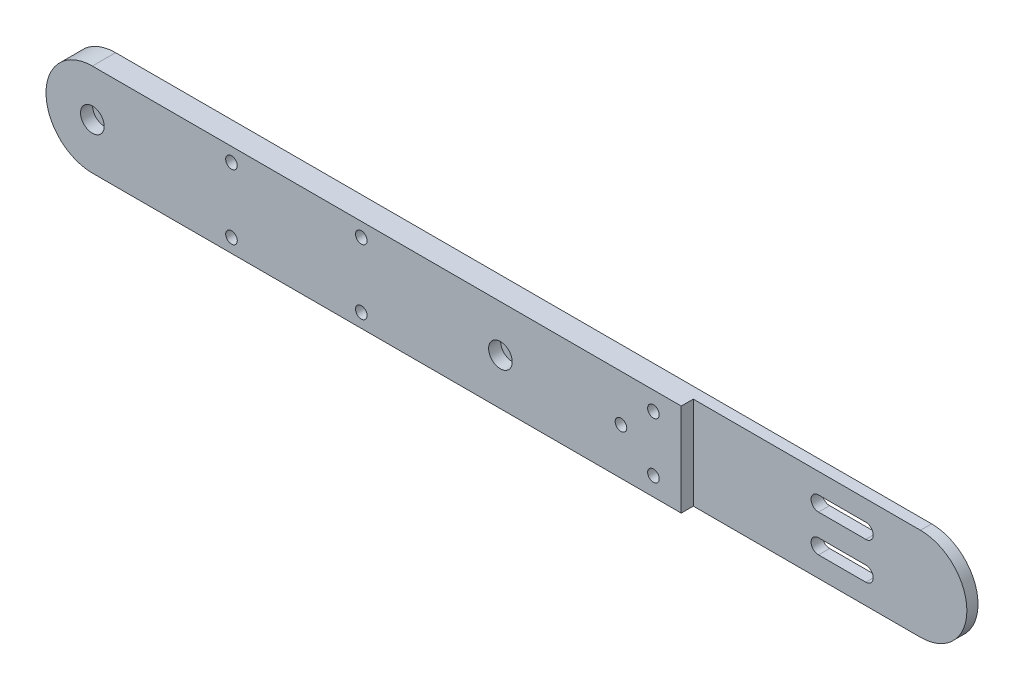
ISO-10303-21;
HEADER;
FILE_DESCRIPTION(('STEP AP214'),'2;1');
FILE_NAME('part.step','',(''),(''),'','','');
FILE_SCHEMA(('AUTOMOTIVE_DESIGN { 1 0 10303 214 1 1 1 1 }'));
ENDSEC;
DATA;
#1=APPLICATION_CONTEXT('core data for automotive mechanical design processes');
#2=APPLICATION_PROTOCOL_DEFINITION('international standard','automotive_design',2000,#1);
#3=PRODUCT_CONTEXT('',#1,'mechanical');
#4=PRODUCT('Part','Part','',(#3));
#5=PRODUCT_RELATED_PRODUCT_CATEGORY('part','',(#4));
#6=PRODUCT_DEFINITION_FORMATION('','',#4);
#7=PRODUCT_DEFINITION_CONTEXT('part definition',#1,'design');
#8=PRODUCT_DEFINITION('design','',#6,#7);
#9=PRODUCT_DEFINITION_SHAPE('','',#8);
#10=(LENGTH_UNIT() NAMED_UNIT(*) SI_UNIT(.MILLI.,.METRE.));
#11=(NAMED_UNIT(*) PLANE_ANGLE_UNIT() SI_UNIT($,.RADIAN.));
#12=(NAMED_UNIT(*) SI_UNIT($,.STERADIAN.) SOLID_ANGLE_UNIT());
#13=UNCERTAINTY_MEASURE_WITH_UNIT(LENGTH_MEASURE(1.E-05),#10,'distance_accuracy_value','');
#14=(GEOMETRIC_REPRESENTATION_CONTEXT(3) GLOBAL_UNCERTAINTY_ASSIGNED_CONTEXT((#13)) GLOBAL_UNIT_ASSIGNED_CONTEXT((#10,
#11,#12)) REPRESENTATION_CONTEXT('',''));
#15=CARTESIAN_POINT('',(0.,0.,0.));
#16=DIRECTION('',(0.,0.,1.));
#17=DIRECTION('',(1.,0.,0.));
#18=AXIS2_PLACEMENT_3D('',#15,#16,#17);
#19=CARTESIAN_POINT('',(121.,6.,25.));
#20=DIRECTION('',(0.,0.,1.));
#21=DIRECTION('',(-1.,0.,0.));
#22=AXIS2_PLACEMENT_3D('',#19,#20,#21);
#23=CYLINDRICAL_SURFACE('',#22,1.25);
#24=CARTESIAN_POINT('',(121.,6.,30.));
#25=DIRECTION('',(0.,0.,-1.));
#26=DIRECTION('',(-1.,0.,0.));
#27=AXIS2_PLACEMENT_3D('',#24,#25,#26);
#28=CIRCLE('',#27,1.25);
#29=CARTESIAN_POINT('',(119.75,6.,30.));
#30=VERTEX_POINT('',#29);
#31=EDGE_CURVE('E340',#30,#30,#28,.T.);
#32=ORIENTED_EDGE('',*,*,#31,.F.);
#33=EDGE_LOOP('',(#32));
#34=FACE_BOUND('',#33,.T.);
#35=CARTESIAN_POINT('',(121.,6.,27.5));
#36=DIRECTION('',(0.,0.,1.));
#37=DIRECTION('',(1.,0.,0.));
#38=AXIS2_PLACEMENT_3D('',#35,#36,#37);
#39=CIRCLE('',#38,1.25);
#40=CARTESIAN_POINT('',(122.25,6.,27.5));
#41=VERTEX_POINT('',#40);
#42=EDGE_CURVE('E356',#41,#41,#39,.F.);
#43=ORIENTED_EDGE('',*,*,#42,.T.);
#44=EDGE_LOOP('',(#43));
#45=FACE_BOUND('',#44,.T.);
#46=ADVANCED_FACE('F132',(#34,#45),#23,.F.);
#47=CARTESIAN_POINT('',(121.,-6.,25.));
#48=DIRECTION('',(0.,0.,1.));
#49=DIRECTION('',(-1.,0.,0.));
#50=AXIS2_PLACEMENT_3D('',#47,#48,#49);
#51=CYLINDRICAL_SURFACE('',#50,1.25);
#52=CARTESIAN_POINT('',(121.,-6.,30.));
#53=DIRECTION('',(0.,0.,-1.));
#54=DIRECTION('',(-1.,0.,0.));
#55=AXIS2_PLACEMENT_3D('',#52,#53,#54);
#56=CIRCLE('',#55,1.25);
#57=CARTESIAN_POINT('',(119.75,-6.,30.));
#58=VERTEX_POINT('',#57);
#59=EDGE_CURVE('E337',#58,#58,#56,.T.);
#60=ORIENTED_EDGE('',*,*,#59,.F.);
#61=EDGE_LOOP('',(#60));
#62=FACE_BOUND('',#61,.T.);
#63=CARTESIAN_POINT('',(121.,-6.,27.5));
#64=DIRECTION('',(0.,0.,1.));
#65=DIRECTION('',(1.,0.,0.));
#66=AXIS2_PLACEMENT_3D('',#63,#64,#65);
#67=CIRCLE('',#66,1.25);
#68=CARTESIAN_POINT('',(122.25,-6.,27.5));
#69=VERTEX_POINT('',#68);
#70=EDGE_CURVE('E431',#69,#69,#67,.F.);
#71=ORIENTED_EDGE('',*,*,#70,.T.);
#72=EDGE_LOOP('',(#71));
#73=FACE_BOUND('',#72,.T.);
#74=ADVANCED_FACE('F472',(#62,#73),#51,.F.);
#75=CARTESIAN_POINT('',(114.,0.,25.));
#76=DIRECTION('',(0.,0.,1.));
#77=DIRECTION('',(-1.,0.,0.));
#78=AXIS2_PLACEMENT_3D('',#75,#76,#77);
#79=CYLINDRICAL_SURFACE('',#78,1.25);
#80=CARTESIAN_POINT('',(114.,0.,30.));
#81=DIRECTION('',(0.,0.,-1.));
#82=DIRECTION('',(-1.,0.,0.));
#83=AXIS2_PLACEMENT_3D('',#80,#81,#82);
#84=CIRCLE('',#83,1.25);
#85=CARTESIAN_POINT('',(112.75,0.,30.));
#86=VERTEX_POINT('',#85);
#87=EDGE_CURVE('E341',#86,#86,#84,.T.);
#88=ORIENTED_EDGE('',*,*,#87,.F.);
#89=EDGE_LOOP('',(#88));
#90=FACE_BOUND('',#89,.T.);
#91=CARTESIAN_POINT('',(114.,0.,27.5));
#92=DIRECTION('',(0.,0.,1.));
#93=DIRECTION('',(1.,0.,0.));
#94=AXIS2_PLACEMENT_3D('',#91,#92,#93);
#95=CIRCLE('',#94,1.25);
#96=CARTESIAN_POINT('',(115.25,0.,27.5));
#97=VERTEX_POINT('',#96);
#98=EDGE_CURVE('E428',#97,#97,#95,.F.);
#99=ORIENTED_EDGE('',*,*,#98,.T.);
#100=EDGE_LOOP('',(#99));
#101=FACE_BOUND('',#100,.T.);
#102=ADVANCED_FACE('F478',(#90,#101),#79,.F.);
#103=CARTESIAN_POINT('',(58.,-7.,25.));
#104=DIRECTION('',(0.,0.,1.));
#105=DIRECTION('',(-1.,0.,0.));
#106=AXIS2_PLACEMENT_3D('',#103,#104,#105);
#107=CYLINDRICAL_SURFACE('',#106,1.25);
#108=CARTESIAN_POINT('',(58.,-7.,30.));
#109=DIRECTION('',(0.,0.,-1.));
#110=DIRECTION('',(-1.,0.,0.));
#111=AXIS2_PLACEMENT_3D('',#108,#109,#110);
#112=CIRCLE('',#111,1.25);
#113=CARTESIAN_POINT('',(56.75,-7.,30.));
#114=VERTEX_POINT('',#113);
#115=EDGE_CURVE('E344',#114,#114,#112,.T.);
#116=ORIENTED_EDGE('',*,*,#115,.F.);
#117=EDGE_LOOP('',(#116));
#118=FACE_BOUND('',#117,.T.);
#119=CARTESIAN_POINT('',(58.,-7.,27.5));
#120=DIRECTION('',(0.,0.,1.));
#121=DIRECTION('',(1.,0.,0.));
#122=AXIS2_PLACEMENT_3D('',#119,#120,#121);
#123=CIRCLE('',#122,1.25);
#124=CARTESIAN_POINT('',(59.25,-7.,27.5));
#125=VERTEX_POINT('',#124);
#126=EDGE_CURVE('E425',#125,#125,#123,.F.);
#127=ORIENTED_EDGE('',*,*,#126,.T.);
#128=EDGE_LOOP('',(#127));
#129=FACE_BOUND('',#128,.T.);
#130=ADVANCED_FACE('F613',(#118,#129),#107,.F.);
#131=CARTESIAN_POINT('',(30.,-7.,25.));
#132=DIRECTION('',(0.,0.,1.));
#133=DIRECTION('',(-1.,0.,0.));
#134=AXIS2_PLACEMENT_3D('',#131,#132,#133);
#135=CYLINDRICAL_SURFACE('',#134,1.25);
#136=CARTESIAN_POINT('',(30.,-7.,30.));
#137=DIRECTION('',(0.,0.,-1.));
#138=DIRECTION('',(-1.,0.,0.));
#139=AXIS2_PLACEMENT_3D('',#136,#137,#138);
#140=CIRCLE('',#139,1.25);
#141=CARTESIAN_POINT('',(28.75,-7.,30.));
#142=VERTEX_POINT('',#141);
#143=EDGE_CURVE('E347',#142,#142,#140,.T.);
#144=ORIENTED_EDGE('',*,*,#143,.F.);
#145=EDGE_LOOP('',(#144));
#146=FACE_BOUND('',#145,.T.);
#147=CARTESIAN_POINT('',(30.,-7.,27.5));
#148=DIRECTION('',(0.,0.,1.));
#149=DIRECTION('',(1.,0.,0.));
#150=AXIS2_PLACEMENT_3D('',#147,#148,#149);
#151=CIRCLE('',#150,1.25);
#152=CARTESIAN_POINT('',(31.25,-7.,27.5));
#153=VERTEX_POINT('',#152);
#154=EDGE_CURVE('E422',#153,#153,#151,.F.);
#155=ORIENTED_EDGE('',*,*,#154,.T.);
#156=EDGE_LOOP('',(#155));
#157=FACE_BOUND('',#156,.T.);
#158=ADVANCED_FACE('F617',(#146,#157),#135,.F.);
#159=CARTESIAN_POINT('',(30.,7.,25.));
#160=DIRECTION('',(0.,0.,1.));
#161=DIRECTION('',(-1.,0.,0.));
#162=AXIS2_PLACEMENT_3D('',#159,#160,#161);
#163=CYLINDRICAL_SURFACE('',#162,1.25);
#164=CARTESIAN_POINT('',(30.,7.,30.));
#165=DIRECTION('',(0.,0.,-1.));
#166=DIRECTION('',(-1.,0.,0.));
#167=AXIS2_PLACEMENT_3D('',#164,#165,#166);
#168=CIRCLE('',#167,1.25);
#169=CARTESIAN_POINT('',(28.75,7.,30.));
#170=VERTEX_POINT('',#169);
#171=EDGE_CURVE('E350',#170,#170,#168,.T.);
#172=ORIENTED_EDGE('',*,*,#171,.F.);
#173=EDGE_LOOP('',(#172));
#174=FACE_BOUND('',#173,.T.);
#175=CARTESIAN_POINT('',(30.,7.,27.5));
#176=DIRECTION('',(0.,0.,1.));
#177=DIRECTION('',(1.,0.,0.));
#178=AXIS2_PLACEMENT_3D('',#175,#176,#177);
#179=CIRCLE('',#178,1.25);
#180=CARTESIAN_POINT('',(31.25,7.,27.5));
#181=VERTEX_POINT('',#180);
#182=EDGE_CURVE('E419',#181,#181,#179,.F.);
#183=ORIENTED_EDGE('',*,*,#182,.T.);
#184=EDGE_LOOP('',(#183));
#185=FACE_BOUND('',#184,.T.);
#186=ADVANCED_FACE('F620',(#174,#185),#163,.F.);
#187=CARTESIAN_POINT('',(58.,7.,25.));
#188=DIRECTION('',(0.,0.,1.));
#189=DIRECTION('',(-1.,0.,0.));
#190=AXIS2_PLACEMENT_3D('',#187,#188,#189);
#191=CYLINDRICAL_SURFACE('',#190,1.25);
#192=CARTESIAN_POINT('',(58.,7.,30.));
#193=DIRECTION('',(0.,0.,-1.));
#194=DIRECTION('',(-1.,0.,0.));
#195=AXIS2_PLACEMENT_3D('',#192,#193,#194);
#196=CIRCLE('',#195,1.25);
#197=CARTESIAN_POINT('',(56.75,7.,30.));
#198=VERTEX_POINT('',#197);
#199=EDGE_CURVE('E353',#198,#198,#196,.T.);
#200=ORIENTED_EDGE('',*,*,#199,.F.);
#201=EDGE_LOOP('',(#200));
#202=FACE_BOUND('',#201,.T.);
#203=CARTESIAN_POINT('',(58.,7.,27.5));
#204=DIRECTION('',(0.,0.,1.));
#205=DIRECTION('',(1.,0.,0.));
#206=AXIS2_PLACEMENT_3D('',#203,#204,#205);
#207=CIRCLE('',#206,1.25);
#208=CARTESIAN_POINT('',(59.25,7.,27.5));
#209=VERTEX_POINT('',#208);
#210=EDGE_CURVE('E336',#209,#209,#207,.F.);
#211=ORIENTED_EDGE('',*,*,#210,.T.);
#212=EDGE_LOOP('',(#211));
#213=FACE_BOUND('',#212,.T.);
#214=ADVANCED_FACE('F485',(#202,#213),#191,.F.);
#215=CARTESIAN_POINT('',(0.,0.,25.));
#216=DIRECTION('',(0.,0.,1.));
#217=DIRECTION('',(-1.,0.,0.));
#218=AXIS2_PLACEMENT_3D('',#215,#216,#217);
#219=CYLINDRICAL_SURFACE('',#218,10.);
#220=DIRECTION('',(0.,0.,1.));
#221=VECTOR('',#220,1.);
#222=CARTESIAN_POINT('',(0.,10.,25.));
#223=LINE('',#222,#221);
#224=CARTESIAN_POINT('',(0.,10.,30.));
#225=VERTEX_POINT('',#224);
#226=CARTESIAN_POINT('',(0.,10.,25.));
#227=VERTEX_POINT('',#226);
#228=EDGE_CURVE('E390',#225,#227,#223,.F.);
#229=ORIENTED_EDGE('',*,*,#228,.T.);
#230=CARTESIAN_POINT('',(0.,0.,25.));
#231=DIRECTION('',(0.,0.,1.));
#232=DIRECTION('',(1.,0.,0.));
#233=AXIS2_PLACEMENT_3D('',#230,#231,#232);
#234=CIRCLE('',#233,10.);
#235=CARTESIAN_POINT('',(0.,-10.,25.));
#236=VERTEX_POINT('',#235);
#237=EDGE_CURVE('E380',#227,#236,#234,.T.);
#238=ORIENTED_EDGE('',*,*,#237,.T.);
#239=DIRECTION('',(0.,0.,1.));
#240=VECTOR('',#239,1.);
#241=CARTESIAN_POINT('',(0.,-10.,25.));
#242=LINE('',#241,#240);
#243=CARTESIAN_POINT('',(0.,-10.,30.));
#244=VERTEX_POINT('',#243);
#245=EDGE_CURVE('E383',#236,#244,#242,.T.);
#246=ORIENTED_EDGE('',*,*,#245,.T.);
#247=CARTESIAN_POINT('',(0.,0.,30.));
#248=DIRECTION('',(0.,0.,1.));
#249=DIRECTION('',(1.,0.,0.));
#250=AXIS2_PLACEMENT_3D('',#247,#248,#249);
#251=CIRCLE('',#250,10.);
#252=EDGE_CURVE('E384',#225,#244,#251,.T.);
#253=ORIENTED_EDGE('',*,*,#252,.F.);
#254=EDGE_LOOP('',(#229,#238,#246,#253));
#255=FACE_BOUND('',#254,.T.);
#256=ADVANCED_FACE('F518',(#255),#219,.T.);
#257=CARTESIAN_POINT('',(0.,0.,30.));
#258=DIRECTION('',(0.,0.,-1.));
#259=DIRECTION('',(1.,0.,0.));
#260=AXIS2_PLACEMENT_3D('',#257,#258,#259);
#261=PLANE('',#260);
#262=ORIENTED_EDGE('',*,*,#199,.T.);
#263=EDGE_LOOP('',(#262));
#264=FACE_BOUND('',#263,.T.);
#265=ORIENTED_EDGE('',*,*,#171,.T.);
#266=EDGE_LOOP('',(#265));
#267=FACE_BOUND('',#266,.T.);
#268=ORIENTED_EDGE('',*,*,#143,.T.);
#269=EDGE_LOOP('',(#268));
#270=FACE_BOUND('',#269,.T.);
#271=ORIENTED_EDGE('',*,*,#115,.T.);
#272=EDGE_LOOP('',(#271));
#273=FACE_BOUND('',#272,.T.);
#274=ORIENTED_EDGE('',*,*,#87,.T.);
#275=EDGE_LOOP('',(#274));
#276=FACE_BOUND('',#275,.T.);
#277=ORIENTED_EDGE('',*,*,#59,.T.);
#278=EDGE_LOOP('',(#277));
#279=FACE_BOUND('',#278,.T.);
#280=ORIENTED_EDGE('',*,*,#31,.T.);
#281=EDGE_LOOP('',(#280));
#282=FACE_BOUND('',#281,.T.);
#283=CARTESIAN_POINT('',(88.,0.,30.));
#284=DIRECTION('',(0.,0.,1.));
#285=DIRECTION('',(1.,0.,0.));
#286=AXIS2_PLACEMENT_3D('',#283,#284,#285);
#287=CIRCLE('',#286,2.54999999999999);
#288=CARTESIAN_POINT('',(90.55,0.,30.));
#289=VERTEX_POINT('',#288);
#290=EDGE_CURVE('E364',#289,#289,#287,.T.);
#291=ORIENTED_EDGE('',*,*,#290,.F.);
#292=EDGE_LOOP('',(#291));
#293=FACE_BOUND('',#292,.T.);
#294=CARTESIAN_POINT('',(0.,0.,30.));
#295=DIRECTION('',(0.,0.,1.));
#296=DIRECTION('',(1.,0.,0.));
#297=AXIS2_PLACEMENT_3D('',#294,#295,#296);
#298=CIRCLE('',#297,2.55);
#299=CARTESIAN_POINT('',(2.55,0.,30.));
#300=VERTEX_POINT('',#299);
#301=EDGE_CURVE('E367',#300,#300,#298,.T.);
#302=ORIENTED_EDGE('',*,*,#301,.F.);
#303=EDGE_LOOP('',(#302));
#304=FACE_BOUND('',#303,.T.);
#305=DIRECTION('',(1.,0.,0.));
#306=VECTOR('',#305,1.);
#307=CARTESIAN_POINT('',(0.,10.,30.));
#308=LINE('',#307,#306);
#309=CARTESIAN_POINT('',(127.,10.,30.));
#310=VERTEX_POINT('',#309);
#311=EDGE_CURVE('E398',#225,#310,#308,.T.);
#312=ORIENTED_EDGE('',*,*,#311,.F.);
#313=ORIENTED_EDGE('',*,*,#252,.T.);
#314=DIRECTION('',(1.,0.,0.));
#315=VECTOR('',#314,1.);
#316=CARTESIAN_POINT('',(0.,-10.,30.));
#317=LINE('',#316,#315);
#318=CARTESIAN_POINT('',(127.,-10.,30.));
#319=VERTEX_POINT('',#318);
#320=EDGE_CURVE('E402',#244,#319,#317,.T.);
#321=ORIENTED_EDGE('',*,*,#320,.T.);
#322=DIRECTION('',(0.,1.,0.));
#323=VECTOR('',#322,1.);
#324=CARTESIAN_POINT('',(127.,-10.,30.));
#325=LINE('',#324,#323);
#326=EDGE_CURVE('E287',#319,#310,#325,.T.);
#327=ORIENTED_EDGE('',*,*,#326,.T.);
#328=EDGE_LOOP('',(#312,#313,#321,#327));
#329=FACE_BOUND('',#328,.T.);
#330=ADVANCED_FACE('F515',(#264,#267,#270,#273,#276,#279,#282,#293,#304,#329),#261,.F.);
#331=CARTESIAN_POINT('',(0.,0.,25.));
#332=DIRECTION('',(0.,0.,-1.));
#333=DIRECTION('',(1.,0.,0.));
#334=AXIS2_PLACEMENT_3D('',#331,#332,#333);
#335=PLANE('',#334);
#336=CARTESIAN_POINT('',(154.,-4.,25.));
#337=DIRECTION('',(0.,0.,1.));
#338=DIRECTION('',(1.,0.,0.));
#339=AXIS2_PLACEMENT_3D('',#336,#337,#338);
#340=CIRCLE('',#339,1.59999999999999);
#341=CARTESIAN_POINT('',(154.,-2.4,25.));
#342=VERTEX_POINT('',#341);
#343=CARTESIAN_POINT('',(154.,-5.6,25.));
#344=VERTEX_POINT('',#343);
#345=EDGE_CURVE('E237',#342,#344,#340,.T.);
#346=ORIENTED_EDGE('',*,*,#345,.T.);
#347=DIRECTION('',(-1.,0.,0.));
#348=VECTOR('',#347,1.);
#349=CARTESIAN_POINT('',(164.2,-5.6,25.));
#350=LINE('',#349,#348);
#351=CARTESIAN_POINT('',(164.2,-5.59999999999999,25.));
#352=VERTEX_POINT('',#351);
#353=EDGE_CURVE('E243',#352,#344,#350,.T.);
#354=ORIENTED_EDGE('',*,*,#353,.F.);
#355=CARTESIAN_POINT('',(164.2,-4.,25.));
#356=DIRECTION('',(0.,0.,1.));
#357=DIRECTION('',(1.,0.,0.));
#358=AXIS2_PLACEMENT_3D('',#355,#356,#357);
#359=CIRCLE('',#358,1.59999999999999);
#360=CARTESIAN_POINT('',(164.2,-2.4,25.));
#361=VERTEX_POINT('',#360);
#362=EDGE_CURVE('E253',#352,#361,#359,.T.);
#363=ORIENTED_EDGE('',*,*,#362,.T.);
#364=DIRECTION('',(-1.,0.,0.));
#365=VECTOR('',#364,1.);
#366=CARTESIAN_POINT('',(164.2,-2.4,25.));
#367=LINE('',#366,#365);
#368=EDGE_CURVE('E247',#361,#342,#367,.T.);
#369=ORIENTED_EDGE('',*,*,#368,.T.);
#370=EDGE_LOOP('',(#346,#354,#363,#369));
#371=FACE_BOUND('',#370,.T.);
#372=DIRECTION('',(-1.,0.,0.));
#373=VECTOR('',#372,1.);
#374=CARTESIAN_POINT('',(164.2,5.6,25.));
#375=LINE('',#374,#373);
#376=CARTESIAN_POINT('',(164.2,5.6,25.));
#377=VERTEX_POINT('',#376);
#378=CARTESIAN_POINT('',(154.,5.59999999999999,25.));
#379=VERTEX_POINT('',#378);
#380=EDGE_CURVE('E267',#377,#379,#375,.T.);
#381=ORIENTED_EDGE('',*,*,#380,.T.);
#382=CARTESIAN_POINT('',(154.,4.,25.));
#383=DIRECTION('',(0.,0.,1.));
#384=DIRECTION('',(1.,0.,0.));
#385=AXIS2_PLACEMENT_3D('',#382,#383,#384);
#386=CIRCLE('',#385,1.59999999999999);
#387=CARTESIAN_POINT('',(154.,2.4,25.));
#388=VERTEX_POINT('',#387);
#389=EDGE_CURVE('E265',#379,#388,#386,.T.);
#390=ORIENTED_EDGE('',*,*,#389,.T.);
#391=DIRECTION('',(-1.,0.,0.));
#392=VECTOR('',#391,1.);
#393=CARTESIAN_POINT('',(164.2,2.4,25.));
#394=LINE('',#393,#392);
#395=CARTESIAN_POINT('',(164.2,2.4,25.));
#396=VERTEX_POINT('',#395);
#397=EDGE_CURVE('E261',#396,#388,#394,.T.);
#398=ORIENTED_EDGE('',*,*,#397,.F.);
#399=CARTESIAN_POINT('',(164.2,4.,25.));
#400=DIRECTION('',(0.,0.,1.));
#401=DIRECTION('',(1.,0.,0.));
#402=AXIS2_PLACEMENT_3D('',#399,#400,#401);
#403=CIRCLE('',#402,1.59999999999999);
#404=EDGE_CURVE('E255',#396,#377,#403,.T.);
#405=ORIENTED_EDGE('',*,*,#404,.T.);
#406=EDGE_LOOP('',(#381,#390,#398,#405));
#407=FACE_BOUND('',#406,.T.);
#408=CARTESIAN_POINT('',(121.,-6.,25.));
#409=DIRECTION('',(0.,0.,1.));
#410=DIRECTION('',(1.,0.,0.));
#411=AXIS2_PLACEMENT_3D('',#408,#409,#410);
#412=CIRCLE('',#411,2.);
#413=CARTESIAN_POINT('',(123.,-6.,25.));
#414=VERTEX_POINT('',#413);
#415=EDGE_CURVE('E310',#414,#414,#412,.T.);
#416=ORIENTED_EDGE('',*,*,#415,.T.);
#417=EDGE_LOOP('',(#416));
#418=FACE_BOUND('',#417,.T.);
#419=CARTESIAN_POINT('',(114.,0.,25.));
#420=DIRECTION('',(0.,0.,1.));
#421=DIRECTION('',(1.,0.,0.));
#422=AXIS2_PLACEMENT_3D('',#419,#420,#421);
#423=CIRCLE('',#422,2.);
#424=CARTESIAN_POINT('',(116.,0.,25.));
#425=VERTEX_POINT('',#424);
#426=EDGE_CURVE('E311',#425,#425,#423,.T.);
#427=ORIENTED_EDGE('',*,*,#426,.T.);
#428=EDGE_LOOP('',(#427));
#429=FACE_BOUND('',#428,.T.);
#430=CARTESIAN_POINT('',(58.,7.,25.));
#431=DIRECTION('',(0.,0.,1.));
#432=DIRECTION('',(1.,0.,0.));
#433=AXIS2_PLACEMENT_3D('',#430,#431,#432);
#434=CIRCLE('',#433,2.);
#435=CARTESIAN_POINT('',(60.,7.,25.));
#436=VERTEX_POINT('',#435);
#437=EDGE_CURVE('E318',#436,#436,#434,.T.);
#438=ORIENTED_EDGE('',*,*,#437,.T.);
#439=EDGE_LOOP('',(#438));
#440=FACE_BOUND('',#439,.T.);
#441=CARTESIAN_POINT('',(30.,7.,25.));
#442=DIRECTION('',(0.,0.,1.));
#443=DIRECTION('',(1.,0.,0.));
#444=AXIS2_PLACEMENT_3D('',#441,#442,#443);
#445=CIRCLE('',#444,2.);
#446=CARTESIAN_POINT('',(32.,7.,25.));
#447=VERTEX_POINT('',#446);
#448=EDGE_CURVE('E324',#447,#447,#445,.T.);
#449=ORIENTED_EDGE('',*,*,#448,.T.);
#450=EDGE_LOOP('',(#449));
#451=FACE_BOUND('',#450,.T.);
#452=CARTESIAN_POINT('',(30.,-7.,25.));
#453=DIRECTION('',(0.,0.,1.));
#454=DIRECTION('',(1.,0.,0.));
#455=AXIS2_PLACEMENT_3D('',#452,#453,#454);
#456=CIRCLE('',#455,2.);
#457=CARTESIAN_POINT('',(32.,-7.,25.));
#458=VERTEX_POINT('',#457);
#459=EDGE_CURVE('E298',#458,#458,#456,.T.);
#460=ORIENTED_EDGE('',*,*,#459,.T.);
#461=EDGE_LOOP('',(#460));
#462=FACE_BOUND('',#461,.T.);
#463=CARTESIAN_POINT('',(58.,-7.,25.));
#464=DIRECTION('',(0.,0.,1.));
#465=DIRECTION('',(1.,0.,0.));
#466=AXIS2_PLACEMENT_3D('',#463,#464,#465);
#467=CIRCLE('',#466,2.);
#468=CARTESIAN_POINT('',(60.,-7.,25.));
#469=VERTEX_POINT('',#468);
#470=EDGE_CURVE('E299',#469,#469,#467,.T.);
#471=ORIENTED_EDGE('',*,*,#470,.T.);
#472=EDGE_LOOP('',(#471));
#473=FACE_BOUND('',#472,.T.);
#474=CARTESIAN_POINT('',(121.,6.,25.));
#475=DIRECTION('',(0.,0.,1.));
#476=DIRECTION('',(1.,0.,0.));
#477=AXIS2_PLACEMENT_3D('',#474,#475,#476);
#478=CIRCLE('',#477,2.);
#479=CARTESIAN_POINT('',(123.,6.,25.));
#480=VERTEX_POINT('',#479);
#481=EDGE_CURVE('E314',#480,#480,#478,.T.);
#482=ORIENTED_EDGE('',*,*,#481,.T.);
#483=EDGE_LOOP('',(#482));
#484=FACE_BOUND('',#483,.T.);
#485=CARTESIAN_POINT('',(0.,0.,25.));
#486=DIRECTION('',(0.,0.,1.));
#487=DIRECTION('',(1.,0.,0.));
#488=AXIS2_PLACEMENT_3D('',#485,#486,#487);
#489=CIRCLE('',#488,1.1);
#490=CARTESIAN_POINT('',(1.1,0.,25.));
#491=VERTEX_POINT('',#490);
#492=EDGE_CURVE('E372',#491,#491,#489,.T.);
#493=ORIENTED_EDGE('',*,*,#492,.T.);
#494=EDGE_LOOP('',(#493));
#495=FACE_BOUND('',#494,.T.);
#496=CARTESIAN_POINT('',(88.,0.,25.));
#497=DIRECTION('',(0.,0.,1.));
#498=DIRECTION('',(1.,0.,0.));
#499=AXIS2_PLACEMENT_3D('',#496,#497,#498);
#500=CIRCLE('',#499,1.09999999999999);
#501=CARTESIAN_POINT('',(89.1,0.,25.));
#502=VERTEX_POINT('',#501);
#503=EDGE_CURVE('E376',#502,#502,#500,.T.);
#504=ORIENTED_EDGE('',*,*,#503,.T.);
#505=EDGE_LOOP('',(#504));
#506=FACE_BOUND('',#505,.T.);
#507=ORIENTED_EDGE('',*,*,#237,.F.);
#508=DIRECTION('',(1.,0.,0.));
#509=VECTOR('',#508,1.);
#510=CARTESIAN_POINT('',(0.,10.,25.));
#511=LINE('',#510,#509);
#512=CARTESIAN_POINT('',(176.,10.,25.));
#513=VERTEX_POINT('',#512);
#514=EDGE_CURVE('E397',#227,#513,#511,.T.);
#515=ORIENTED_EDGE('',*,*,#514,.T.);
#516=CARTESIAN_POINT('',(176.,0.,25.));
#517=DIRECTION('',(0.,0.,1.));
#518=DIRECTION('',(1.,0.,0.));
#519=AXIS2_PLACEMENT_3D('',#516,#517,#518);
#520=CIRCLE('',#519,10.);
#521=CARTESIAN_POINT('',(176.,-10.,25.));
#522=VERTEX_POINT('',#521);
#523=EDGE_CURVE('E375',#522,#513,#520,.T.);
#524=ORIENTED_EDGE('',*,*,#523,.F.);
#525=DIRECTION('',(1.,0.,0.));
#526=VECTOR('',#525,1.);
#527=CARTESIAN_POINT('',(0.,-10.,25.));
#528=LINE('',#527,#526);
#529=EDGE_CURVE('E394',#236,#522,#528,.T.);
#530=ORIENTED_EDGE('',*,*,#529,.F.);
#531=EDGE_LOOP('',(#507,#515,#524,#530));
#532=FACE_BOUND('',#531,.T.);
#533=ADVANCED_FACE('F250',(#371,#407,#418,#429,#440,#451,#462,#473,#484,#495,#506,#532),#335,.T.);
#534=CARTESIAN_POINT('',(176.,0.,25.));
#535=DIRECTION('',(0.,0.,1.));
#536=DIRECTION('',(-1.,0.,0.));
#537=AXIS2_PLACEMENT_3D('',#534,#535,#536);
#538=CYLINDRICAL_SURFACE('',#537,10.);
#539=CARTESIAN_POINT('',(176.,0.,27.4));
#540=DIRECTION('',(0.,0.,1.));
#541=DIRECTION('',(1.,0.,0.));
#542=AXIS2_PLACEMENT_3D('',#539,#540,#541);
#543=CIRCLE('',#542,10.);
#544=CARTESIAN_POINT('',(176.,-10.,27.4));
#545=VERTEX_POINT('',#544);
#546=CARTESIAN_POINT('',(176.,10.,27.4));
#547=VERTEX_POINT('',#546);
#548=EDGE_CURVE('E290',#545,#547,#543,.T.);
#549=ORIENTED_EDGE('',*,*,#548,.F.);
#550=DIRECTION('',(0.,0.,1.));
#551=VECTOR('',#550,1.);
#552=CARTESIAN_POINT('',(176.,-10.,25.));
#553=LINE('',#552,#551);
#554=EDGE_CURVE('E387',#522,#545,#553,.T.);
#555=ORIENTED_EDGE('',*,*,#554,.F.);
#556=ORIENTED_EDGE('',*,*,#523,.T.);
#557=DIRECTION('',(0.,0.,1.));
#558=VECTOR('',#557,1.);
#559=CARTESIAN_POINT('',(176.,10.,25.));
#560=LINE('',#559,#558);
#561=EDGE_CURVE('E401',#513,#547,#560,.T.);
#562=ORIENTED_EDGE('',*,*,#561,.T.);
#563=EDGE_LOOP('',(#549,#555,#556,#562));
#564=FACE_BOUND('',#563,.T.);
#565=ADVANCED_FACE('F134',(#564),#538,.T.);
#566=CARTESIAN_POINT('',(0.,10.,25.));
#567=DIRECTION('',(0.,1.,0.));
#568=DIRECTION('',(0.,0.,-1.));
#569=AXIS2_PLACEMENT_3D('',#566,#567,#568);
#570=PLANE('',#569);
#571=DIRECTION('',(0.,0.,-1.));
#572=VECTOR('',#571,1.);
#573=CARTESIAN_POINT('',(127.,10.,30.));
#574=LINE('',#573,#572);
#575=CARTESIAN_POINT('',(127.,10.,27.4));
#576=VERTEX_POINT('',#575);
#577=EDGE_CURVE('E283',#310,#576,#574,.T.);
#578=ORIENTED_EDGE('',*,*,#577,.T.);
#579=DIRECTION('',(1.,0.,0.));
#580=VECTOR('',#579,1.);
#581=CARTESIAN_POINT('',(127.,10.,27.4));
#582=LINE('',#581,#580);
#583=EDGE_CURVE('E280',#576,#547,#582,.T.);
#584=ORIENTED_EDGE('',*,*,#583,.T.);
#585=ORIENTED_EDGE('',*,*,#561,.F.);
#586=ORIENTED_EDGE('',*,*,#514,.F.);
#587=ORIENTED_EDGE('',*,*,#228,.F.);
#588=ORIENTED_EDGE('',*,*,#311,.T.);
#589=EDGE_LOOP('',(#578,#584,#585,#586,#587,#588));
#590=FACE_BOUND('',#589,.T.);
#591=ADVANCED_FACE('F523',(#590),#570,.T.);
#592=CARTESIAN_POINT('',(0.,-10.,25.));
#593=DIRECTION('',(0.,1.,0.));
#594=DIRECTION('',(0.,0.,-1.));
#595=AXIS2_PLACEMENT_3D('',#592,#593,#594);
#596=PLANE('',#595);
#597=ORIENTED_EDGE('',*,*,#320,.F.);
#598=ORIENTED_EDGE('',*,*,#245,.F.);
#599=ORIENTED_EDGE('',*,*,#529,.T.);
#600=ORIENTED_EDGE('',*,*,#554,.T.);
#601=DIRECTION('',(1.,0.,0.));
#602=VECTOR('',#601,1.);
#603=CARTESIAN_POINT('',(127.,-10.,27.4));
#604=LINE('',#603,#602);
#605=CARTESIAN_POINT('',(127.,-10.,27.4));
#606=VERTEX_POINT('',#605);
#607=EDGE_CURVE('E279',#606,#545,#604,.T.);
#608=ORIENTED_EDGE('',*,*,#607,.F.);
#609=DIRECTION('',(0.,0.,-1.));
#610=VECTOR('',#609,1.);
#611=CARTESIAN_POINT('',(127.,-10.,30.));
#612=LINE('',#611,#610);
#613=EDGE_CURVE('E276',#319,#606,#612,.T.);
#614=ORIENTED_EDGE('',*,*,#613,.F.);
#615=EDGE_LOOP('',(#597,#598,#599,#600,#608,#614));
#616=FACE_BOUND('',#615,.T.);
#617=ADVANCED_FACE('F511',(#616),#596,.F.);
#618=CARTESIAN_POINT('',(88.,0.,25.));
#619=DIRECTION('',(0.,0.,1.));
#620=DIRECTION('',(-1.,0.,0.));
#621=AXIS2_PLACEMENT_3D('',#618,#619,#620);
#622=CYLINDRICAL_SURFACE('',#621,1.09999999999999);
#623=CARTESIAN_POINT('',(88.,0.,27.4));
#624=DIRECTION('',(0.,0.,1.));
#625=DIRECTION('',(1.,0.,0.));
#626=AXIS2_PLACEMENT_3D('',#623,#624,#625);
#627=CIRCLE('',#626,1.09999999999999);
#628=CARTESIAN_POINT('',(89.1,0.,27.4));
#629=VERTEX_POINT('',#628);
#630=EDGE_CURVE('E379',#629,#629,#627,.T.);
#631=ORIENTED_EDGE('',*,*,#630,.T.);
#632=EDGE_LOOP('',(#631));
#633=FACE_BOUND('',#632,.T.);
#634=ORIENTED_EDGE('',*,*,#503,.F.);
#635=EDGE_LOOP('',(#634));
#636=FACE_BOUND('',#635,.T.);
#637=ADVANCED_FACE('F507',(#633,#636),#622,.F.);
#638=CARTESIAN_POINT('',(0.,0.,25.));
#639=DIRECTION('',(0.,0.,1.));
#640=DIRECTION('',(-1.,0.,0.));
#641=AXIS2_PLACEMENT_3D('',#638,#639,#640);
#642=CYLINDRICAL_SURFACE('',#641,1.1);
#643=CARTESIAN_POINT('',(0.,0.,27.4));
#644=DIRECTION('',(0.,0.,1.));
#645=DIRECTION('',(1.,0.,0.));
#646=AXIS2_PLACEMENT_3D('',#643,#644,#645);
#647=CIRCLE('',#646,1.1);
#648=CARTESIAN_POINT('',(1.1,0.,27.4));
#649=VERTEX_POINT('',#648);
#650=EDGE_CURVE('E363',#649,#649,#647,.T.);
#651=ORIENTED_EDGE('',*,*,#650,.T.);
#652=EDGE_LOOP('',(#651));
#653=FACE_BOUND('',#652,.T.);
#654=ORIENTED_EDGE('',*,*,#492,.F.);
#655=EDGE_LOOP('',(#654));
#656=FACE_BOUND('',#655,.T.);
#657=ADVANCED_FACE('F500',(#653,#656),#642,.F.);
#658=CARTESIAN_POINT('',(0.,0.,27.4));
#659=DIRECTION('',(0.,0.,1.));
#660=DIRECTION('',(-1.,0.,0.));
#661=AXIS2_PLACEMENT_3D('',#658,#659,#660);
#662=CYLINDRICAL_SURFACE('',#661,2.55);
#663=CARTESIAN_POINT('',(0.,0.,27.4));
#664=DIRECTION('',(0.,0.,1.));
#665=DIRECTION('',(1.,0.,0.));
#666=AXIS2_PLACEMENT_3D('',#663,#664,#665);
#667=CIRCLE('',#666,2.55);
#668=CARTESIAN_POINT('',(2.55,0.,27.4));
#669=VERTEX_POINT('',#668);
#670=EDGE_CURVE('E359',#669,#669,#667,.T.);
#671=ORIENTED_EDGE('',*,*,#670,.F.);
#672=EDGE_LOOP('',(#671));
#673=FACE_BOUND('',#672,.T.);
#674=ORIENTED_EDGE('',*,*,#301,.T.);
#675=EDGE_LOOP('',(#674));
#676=FACE_BOUND('',#675,.T.);
#677=ADVANCED_FACE('F497',(#673,#676),#662,.F.);
#678=CARTESIAN_POINT('',(0.,0.,27.4));
#679=DIRECTION('',(0.,0.,-1.));
#680=DIRECTION('',(1.,0.,0.));
#681=AXIS2_PLACEMENT_3D('',#678,#679,#680);
#682=PLANE('',#681);
#683=ORIENTED_EDGE('',*,*,#650,.F.);
#684=EDGE_LOOP('',(#683));
#685=FACE_BOUND('',#684,.T.);
#686=ORIENTED_EDGE('',*,*,#670,.T.);
#687=EDGE_LOOP('',(#686));
#688=FACE_BOUND('',#687,.T.);
#689=ADVANCED_FACE('F495',(#685,#688),#682,.F.);
#690=CARTESIAN_POINT('',(88.,0.,27.4));
#691=DIRECTION('',(0.,0.,1.));
#692=DIRECTION('',(-1.,0.,0.));
#693=AXIS2_PLACEMENT_3D('',#690,#691,#692);
#694=CYLINDRICAL_SURFACE('',#693,2.54999999999999);
#695=CARTESIAN_POINT('',(88.,0.,27.4));
#696=DIRECTION('',(0.,0.,1.));
#697=DIRECTION('',(1.,0.,0.));
#698=AXIS2_PLACEMENT_3D('',#695,#696,#697);
#699=CIRCLE('',#698,2.54999999999999);
#700=CARTESIAN_POINT('',(90.55,0.,27.4));
#701=VERTEX_POINT('',#700);
#702=EDGE_CURVE('E360',#701,#701,#699,.T.);
#703=ORIENTED_EDGE('',*,*,#702,.F.);
#704=EDGE_LOOP('',(#703));
#705=FACE_BOUND('',#704,.T.);
#706=ORIENTED_EDGE('',*,*,#290,.T.);
#707=EDGE_LOOP('',(#706));
#708=FACE_BOUND('',#707,.T.);
#709=ADVANCED_FACE('F491',(#705,#708),#694,.F.);
#710=CARTESIAN_POINT('',(88.,0.,27.4));
#711=DIRECTION('',(0.,0.,-1.));
#712=DIRECTION('',(1.,0.,0.));
#713=AXIS2_PLACEMENT_3D('',#710,#711,#712);
#714=PLANE('',#713);
#715=ORIENTED_EDGE('',*,*,#630,.F.);
#716=EDGE_LOOP('',(#715));
#717=FACE_BOUND('',#716,.T.);
#718=ORIENTED_EDGE('',*,*,#702,.T.);
#719=EDGE_LOOP('',(#718));
#720=FACE_BOUND('',#719,.T.);
#721=ADVANCED_FACE('F487',(#717,#720),#714,.F.);
#722=CARTESIAN_POINT('',(0.,0.,27.5));
#723=DIRECTION('',(0.,0.,-1.));
#724=DIRECTION('',(1.,0.,0.));
#725=AXIS2_PLACEMENT_3D('',#722,#723,#724);
#726=PLANE('',#725);
#727=CARTESIAN_POINT('',(58.,7.,27.5));
#728=DIRECTION('',(0.,0.,1.));
#729=DIRECTION('',(1.,0.,0.));
#730=AXIS2_PLACEMENT_3D('',#727,#728,#729);
#731=CIRCLE('',#730,2.);
#732=CARTESIAN_POINT('',(60.,7.,27.5));
#733=VERTEX_POINT('',#732);
#734=EDGE_CURVE('E321',#733,#733,#731,.F.);
#735=ORIENTED_EDGE('',*,*,#734,.T.);
#736=EDGE_LOOP('',(#735));
#737=FACE_BOUND('',#736,.T.);
#738=ORIENTED_EDGE('',*,*,#210,.F.);
#739=EDGE_LOOP('',(#738));
#740=FACE_BOUND('',#739,.T.);
#741=ADVANCED_FACE('F490',(#737,#740),#726,.T.);
#742=CARTESIAN_POINT('',(58.,7.,35.6568542494924));
#743=DIRECTION('',(0.,0.,-1.));
#744=DIRECTION('',(1.,0.,0.));
#745=AXIS2_PLACEMENT_3D('',#742,#743,#744);
#746=CYLINDRICAL_SURFACE('',#745,2.);
#747=ORIENTED_EDGE('',*,*,#734,.F.);
#748=EDGE_LOOP('',(#747));
#749=FACE_BOUND('',#748,.T.);
#750=ORIENTED_EDGE('',*,*,#437,.F.);
#751=EDGE_LOOP('',(#750));
#752=FACE_BOUND('',#751,.T.);
#753=ADVANCED_FACE('F591',(#749,#752),#746,.F.);
#754=CARTESIAN_POINT('',(0.,0.,27.5));
#755=DIRECTION('',(0.,0.,-1.));
#756=DIRECTION('',(1.,0.,0.));
#757=AXIS2_PLACEMENT_3D('',#754,#755,#756);
#758=PLANE('',#757);
#759=CARTESIAN_POINT('',(30.,7.,27.5));
#760=DIRECTION('',(0.,0.,1.));
#761=DIRECTION('',(1.,0.,0.));
#762=AXIS2_PLACEMENT_3D('',#759,#760,#761);
#763=CIRCLE('',#762,2.);
#764=CARTESIAN_POINT('',(32.,7.,27.5));
#765=VERTEX_POINT('',#764);
#766=EDGE_CURVE('E302',#765,#765,#763,.F.);
#767=ORIENTED_EDGE('',*,*,#766,.T.);
#768=EDGE_LOOP('',(#767));
#769=FACE_BOUND('',#768,.T.);
#770=ORIENTED_EDGE('',*,*,#182,.F.);
#771=EDGE_LOOP('',(#770));
#772=FACE_BOUND('',#771,.T.);
#773=ADVANCED_FACE('F594',(#769,#772),#758,.T.);
#774=CARTESIAN_POINT('',(30.,7.,35.6568542494924));
#775=DIRECTION('',(0.,0.,-1.));
#776=DIRECTION('',(1.,0.,0.));
#777=AXIS2_PLACEMENT_3D('',#774,#775,#776);
#778=CYLINDRICAL_SURFACE('',#777,2.);
#779=ORIENTED_EDGE('',*,*,#766,.F.);
#780=EDGE_LOOP('',(#779));
#781=FACE_BOUND('',#780,.T.);
#782=ORIENTED_EDGE('',*,*,#448,.F.);
#783=EDGE_LOOP('',(#782));
#784=FACE_BOUND('',#783,.T.);
#785=ADVANCED_FACE('F565',(#781,#784),#778,.F.);
#786=CARTESIAN_POINT('',(0.,0.,27.5));
#787=DIRECTION('',(0.,0.,-1.));
#788=DIRECTION('',(1.,0.,0.));
#789=AXIS2_PLACEMENT_3D('',#786,#787,#788);
#790=PLANE('',#789);
#791=CARTESIAN_POINT('',(30.,-7.,27.5));
#792=DIRECTION('',(0.,0.,1.));
#793=DIRECTION('',(1.,0.,0.));
#794=AXIS2_PLACEMENT_3D('',#791,#792,#793);
#795=CIRCLE('',#794,2.);
#796=CARTESIAN_POINT('',(32.,-7.,27.5));
#797=VERTEX_POINT('',#796);
#798=EDGE_CURVE('E295',#797,#797,#795,.F.);
#799=ORIENTED_EDGE('',*,*,#798,.T.);
#800=EDGE_LOOP('',(#799));
#801=FACE_BOUND('',#800,.T.);
#802=ORIENTED_EDGE('',*,*,#154,.F.);
#803=EDGE_LOOP('',(#802));
#804=FACE_BOUND('',#803,.T.);
#805=ADVANCED_FACE('F561',(#801,#804),#790,.T.);
#806=CARTESIAN_POINT('',(30.,-7.,35.6568542494924));
#807=DIRECTION('',(0.,0.,-1.));
#808=DIRECTION('',(1.,0.,0.));
#809=AXIS2_PLACEMENT_3D('',#806,#807,#808);
#810=CYLINDRICAL_SURFACE('',#809,2.);
#811=ORIENTED_EDGE('',*,*,#798,.F.);
#812=EDGE_LOOP('',(#811));
#813=FACE_BOUND('',#812,.T.);
#814=ORIENTED_EDGE('',*,*,#459,.F.);
#815=EDGE_LOOP('',(#814));
#816=FACE_BOUND('',#815,.T.);
#817=ADVANCED_FACE('F557',(#813,#816),#810,.F.);
#818=CARTESIAN_POINT('',(0.,0.,27.5));
#819=DIRECTION('',(0.,0.,-1.));
#820=DIRECTION('',(1.,0.,0.));
#821=AXIS2_PLACEMENT_3D('',#818,#819,#820);
#822=PLANE('',#821);
#823=CARTESIAN_POINT('',(58.,-7.,27.5));
#824=DIRECTION('',(0.,0.,1.));
#825=DIRECTION('',(1.,0.,0.));
#826=AXIS2_PLACEMENT_3D('',#823,#824,#825);
#827=CIRCLE('',#826,2.);
#828=CARTESIAN_POINT('',(60.,-7.,27.5));
#829=VERTEX_POINT('',#828);
#830=EDGE_CURVE('E294',#829,#829,#827,.F.);
#831=ORIENTED_EDGE('',*,*,#830,.T.);
#832=EDGE_LOOP('',(#831));
#833=FACE_BOUND('',#832,.T.);
#834=ORIENTED_EDGE('',*,*,#126,.F.);
#835=EDGE_LOOP('',(#834));
#836=FACE_BOUND('',#835,.T.);
#837=ADVANCED_FACE('F560',(#833,#836),#822,.T.);
#838=CARTESIAN_POINT('',(58.,-7.,35.6568542494924));
#839=DIRECTION('',(0.,0.,-1.));
#840=DIRECTION('',(1.,0.,0.));
#841=AXIS2_PLACEMENT_3D('',#838,#839,#840);
#842=CYLINDRICAL_SURFACE('',#841,2.);
#843=ORIENTED_EDGE('',*,*,#830,.F.);
#844=EDGE_LOOP('',(#843));
#845=FACE_BOUND('',#844,.T.);
#846=ORIENTED_EDGE('',*,*,#470,.F.);
#847=EDGE_LOOP('',(#846));
#848=FACE_BOUND('',#847,.T.);
#849=ADVANCED_FACE('F567',(#845,#848),#842,.F.);
#850=CARTESIAN_POINT('',(0.,0.,27.5));
#851=DIRECTION('',(0.,0.,-1.));
#852=DIRECTION('',(1.,0.,0.));
#853=AXIS2_PLACEMENT_3D('',#850,#851,#852);
#854=PLANE('',#853);
#855=CARTESIAN_POINT('',(114.,0.,27.5));
#856=DIRECTION('',(0.,0.,1.));
#857=DIRECTION('',(1.,0.,0.));
#858=AXIS2_PLACEMENT_3D('',#855,#856,#857);
#859=CIRCLE('',#858,2.);
#860=CARTESIAN_POINT('',(116.,0.,27.5));
#861=VERTEX_POINT('',#860);
#862=EDGE_CURVE('E315',#861,#861,#859,.F.);
#863=ORIENTED_EDGE('',*,*,#862,.T.);
#864=EDGE_LOOP('',(#863));
#865=FACE_BOUND('',#864,.T.);
#866=ORIENTED_EDGE('',*,*,#98,.F.);
#867=EDGE_LOOP('',(#866));
#868=FACE_BOUND('',#867,.T.);
#869=ADVANCED_FACE('F570',(#865,#868),#854,.T.);
#870=CARTESIAN_POINT('',(114.,0.,35.6568542494924));
#871=DIRECTION('',(0.,0.,-1.));
#872=DIRECTION('',(1.,0.,0.));
#873=AXIS2_PLACEMENT_3D('',#870,#871,#872);
#874=CYLINDRICAL_SURFACE('',#873,2.);
#875=ORIENTED_EDGE('',*,*,#862,.F.);
#876=EDGE_LOOP('',(#875));
#877=FACE_BOUND('',#876,.T.);
#878=ORIENTED_EDGE('',*,*,#426,.F.);
#879=EDGE_LOOP('',(#878));
#880=FACE_BOUND('',#879,.T.);
#881=ADVANCED_FACE('F583',(#877,#880),#874,.F.);
#882=CARTESIAN_POINT('',(0.,0.,27.5));
#883=DIRECTION('',(0.,0.,-1.));
#884=DIRECTION('',(1.,0.,0.));
#885=AXIS2_PLACEMENT_3D('',#882,#883,#884);
#886=PLANE('',#885);
#887=CARTESIAN_POINT('',(121.,-6.,27.5));
#888=DIRECTION('',(0.,0.,1.));
#889=DIRECTION('',(1.,0.,0.));
#890=AXIS2_PLACEMENT_3D('',#887,#888,#889);
#891=CIRCLE('',#890,2.);
#892=CARTESIAN_POINT('',(123.,-6.,27.5));
#893=VERTEX_POINT('',#892);
#894=EDGE_CURVE('E307',#893,#893,#891,.F.);
#895=ORIENTED_EDGE('',*,*,#894,.T.);
#896=EDGE_LOOP('',(#895));
#897=FACE_BOUND('',#896,.T.);
#898=ORIENTED_EDGE('',*,*,#70,.F.);
#899=EDGE_LOOP('',(#898));
#900=FACE_BOUND('',#899,.T.);
#901=ADVANCED_FACE('F579',(#897,#900),#886,.T.);
#902=CARTESIAN_POINT('',(121.,-6.,35.6568542494924));
#903=DIRECTION('',(0.,0.,-1.));
#904=DIRECTION('',(1.,0.,0.));
#905=AXIS2_PLACEMENT_3D('',#902,#903,#904);
#906=CYLINDRICAL_SURFACE('',#905,2.);
#907=ORIENTED_EDGE('',*,*,#894,.F.);
#908=EDGE_LOOP('',(#907));
#909=FACE_BOUND('',#908,.T.);
#910=ORIENTED_EDGE('',*,*,#415,.F.);
#911=EDGE_LOOP('',(#910));
#912=FACE_BOUND('',#911,.T.);
#913=ADVANCED_FACE('F575',(#909,#912),#906,.F.);
#914=CARTESIAN_POINT('',(0.,0.,27.5));
#915=DIRECTION('',(0.,0.,-1.));
#916=DIRECTION('',(1.,0.,0.));
#917=AXIS2_PLACEMENT_3D('',#914,#915,#916);
#918=PLANE('',#917);
#919=CARTESIAN_POINT('',(121.,6.,27.5));
#920=DIRECTION('',(0.,0.,1.));
#921=DIRECTION('',(1.,0.,0.));
#922=AXIS2_PLACEMENT_3D('',#919,#920,#921);
#923=CIRCLE('',#922,2.);
#924=CARTESIAN_POINT('',(123.,6.,27.5));
#925=VERTEX_POINT('',#924);
#926=EDGE_CURVE('E333',#925,#925,#923,.F.);
#927=ORIENTED_EDGE('',*,*,#926,.T.);
#928=EDGE_LOOP('',(#927));
#929=FACE_BOUND('',#928,.T.);
#930=ORIENTED_EDGE('',*,*,#42,.F.);
#931=EDGE_LOOP('',(#930));
#932=FACE_BOUND('',#931,.T.);
#933=ADVANCED_FACE('F578',(#929,#932),#918,.T.);
#934=CARTESIAN_POINT('',(121.,6.,35.6568542494924));
#935=DIRECTION('',(0.,0.,-1.));
#936=DIRECTION('',(1.,0.,0.));
#937=AXIS2_PLACEMENT_3D('',#934,#935,#936);
#938=CYLINDRICAL_SURFACE('',#937,2.);
#939=ORIENTED_EDGE('',*,*,#926,.F.);
#940=EDGE_LOOP('',(#939));
#941=FACE_BOUND('',#940,.T.);
#942=ORIENTED_EDGE('',*,*,#481,.F.);
#943=EDGE_LOOP('',(#942));
#944=FACE_BOUND('',#943,.T.);
#945=ADVANCED_FACE('F554',(#941,#944),#938,.F.);
#946=CARTESIAN_POINT('',(127.,-10.,27.4));
#947=DIRECTION('',(0.,0.,-1.));
#948=DIRECTION('',(1.,0.,0.));
#949=AXIS2_PLACEMENT_3D('',#946,#947,#948);
#950=PLANE('',#949);
#951=DIRECTION('',(-1.,0.,0.));
#952=VECTOR('',#951,1.);
#953=CARTESIAN_POINT('',(127.,-2.4,27.4));
#954=LINE('',#953,#952);
#955=CARTESIAN_POINT('',(164.2,-2.40000000000001,27.4));
#956=VERTEX_POINT('',#955);
#957=CARTESIAN_POINT('',(154.,-2.4,27.4));
#958=VERTEX_POINT('',#957);
#959=EDGE_CURVE('E140',#956,#958,#954,.T.);
#960=ORIENTED_EDGE('',*,*,#959,.F.);
#961=CARTESIAN_POINT('',(164.2,-4.,27.4));
#962=DIRECTION('',(0.,0.,1.));
#963=DIRECTION('',(1.,0.,0.));
#964=AXIS2_PLACEMENT_3D('',#961,#962,#963);
#965=CIRCLE('',#964,1.59999999999999);
#966=CARTESIAN_POINT('',(164.2,-5.6,27.4));
#967=VERTEX_POINT('',#966);
#968=EDGE_CURVE('E446',#967,#956,#965,.T.);
#969=ORIENTED_EDGE('',*,*,#968,.F.);
#970=DIRECTION('',(-1.,0.,0.));
#971=VECTOR('',#970,1.);
#972=CARTESIAN_POINT('',(127.,-5.6,27.4));
#973=LINE('',#972,#971);
#974=CARTESIAN_POINT('',(154.,-5.6,27.4));
#975=VERTEX_POINT('',#974);
#976=EDGE_CURVE('E449',#967,#975,#973,.T.);
#977=ORIENTED_EDGE('',*,*,#976,.T.);
#978=CARTESIAN_POINT('',(154.,-4.,27.4));
#979=DIRECTION('',(0.,0.,1.));
#980=DIRECTION('',(1.,0.,0.));
#981=AXIS2_PLACEMENT_3D('',#978,#979,#980);
#982=CIRCLE('',#981,1.59999999999999);
#983=EDGE_CURVE('E13',#958,#975,#982,.T.);
#984=ORIENTED_EDGE('',*,*,#983,.F.);
#985=EDGE_LOOP('',(#960,#969,#977,#984));
#986=FACE_BOUND('',#985,.T.);
#987=CARTESIAN_POINT('',(164.2,4.,27.4));
#988=DIRECTION('',(0.,0.,1.));
#989=DIRECTION('',(1.,0.,0.));
#990=AXIS2_PLACEMENT_3D('',#987,#988,#989);
#991=CIRCLE('',#990,1.59999999999999);
#992=CARTESIAN_POINT('',(164.2,2.4,27.4));
#993=VERTEX_POINT('',#992);
#994=CARTESIAN_POINT('',(164.2,5.6,27.4));
#995=VERTEX_POINT('',#994);
#996=EDGE_CURVE('E438',#993,#995,#991,.T.);
#997=ORIENTED_EDGE('',*,*,#996,.F.);
#998=DIRECTION('',(-1.,0.,0.));
#999=VECTOR('',#998,1.);
#1000=CARTESIAN_POINT('',(127.,2.4,27.4));
#1001=LINE('',#1000,#999);
#1002=CARTESIAN_POINT('',(154.,2.40000000000001,27.4));
#1003=VERTEX_POINT('',#1002);
#1004=EDGE_CURVE('E393',#993,#1003,#1001,.T.);
#1005=ORIENTED_EDGE('',*,*,#1004,.T.);
#1006=CARTESIAN_POINT('',(154.,4.,27.4));
#1007=DIRECTION('',(0.,0.,1.));
#1008=DIRECTION('',(1.,0.,0.));
#1009=AXIS2_PLACEMENT_3D('',#1006,#1007,#1008);
#1010=CIRCLE('',#1009,1.59999999999999);
#1011=CARTESIAN_POINT('',(154.,5.6,27.4));
#1012=VERTEX_POINT('',#1011);
#1013=EDGE_CURVE('E441',#1012,#1003,#1010,.T.);
#1014=ORIENTED_EDGE('',*,*,#1013,.F.);
#1015=DIRECTION('',(-1.,0.,0.));
#1016=VECTOR('',#1015,1.);
#1017=CARTESIAN_POINT('',(127.,5.6,27.4));
#1018=LINE('',#1017,#1016);
#1019=EDGE_CURVE('E443',#995,#1012,#1018,.T.);
#1020=ORIENTED_EDGE('',*,*,#1019,.F.);
#1021=EDGE_LOOP('',(#997,#1005,#1014,#1020));
#1022=FACE_BOUND('',#1021,.T.);
#1023=ORIENTED_EDGE('',*,*,#548,.T.);
#1024=ORIENTED_EDGE('',*,*,#583,.F.);
#1025=DIRECTION('',(0.,1.,0.));
#1026=VECTOR('',#1025,1.);
#1027=CARTESIAN_POINT('',(127.,-10.,27.4));
#1028=LINE('',#1027,#1026);
#1029=EDGE_CURVE('E282',#606,#576,#1028,.T.);
#1030=ORIENTED_EDGE('',*,*,#1029,.F.);
#1031=ORIENTED_EDGE('',*,*,#607,.T.);
#1032=EDGE_LOOP('',(#1023,#1024,#1030,#1031));
#1033=FACE_BOUND('',#1032,.T.);
#1034=ADVANCED_FACE('F457',(#986,#1022,#1033),#950,.F.);
#1035=CARTESIAN_POINT('',(127.,-10.,30.));
#1036=DIRECTION('',(-1.,0.,0.));
#1037=DIRECTION('',(0.,0.,-1.));
#1038=AXIS2_PLACEMENT_3D('',#1035,#1036,#1037);
#1039=PLANE('',#1038);
#1040=ORIENTED_EDGE('',*,*,#577,.F.);
#1041=ORIENTED_EDGE('',*,*,#326,.F.);
#1042=ORIENTED_EDGE('',*,*,#613,.T.);
#1043=ORIENTED_EDGE('',*,*,#1029,.T.);
#1044=EDGE_LOOP('',(#1040,#1041,#1042,#1043));
#1045=FACE_BOUND('',#1044,.T.);
#1046=ADVANCED_FACE('F544',(#1045),#1039,.F.);
#1047=CARTESIAN_POINT('',(154.,4.,30.));
#1048=DIRECTION('',(0.,0.,-1.));
#1049=DIRECTION('',(1.,0.,0.));
#1050=AXIS2_PLACEMENT_3D('',#1047,#1048,#1049);
#1051=CYLINDRICAL_SURFACE('',#1050,1.59999999999999);
#1052=DIRECTION('',(0.,0.,-1.));
#1053=VECTOR('',#1052,1.);
#1054=CARTESIAN_POINT('',(154.,5.6,30.));
#1055=LINE('',#1054,#1053);
#1056=EDGE_CURVE('E272',#379,#1012,#1055,.F.);
#1057=ORIENTED_EDGE('',*,*,#1056,.T.);
#1058=ORIENTED_EDGE('',*,*,#1013,.T.);
#1059=DIRECTION('',(0.,0.,-1.));
#1060=VECTOR('',#1059,1.);
#1061=CARTESIAN_POINT('',(154.,2.40000000000001,30.));
#1062=LINE('',#1061,#1060);
#1063=EDGE_CURVE('E155',#388,#1003,#1062,.F.);
#1064=ORIENTED_EDGE('',*,*,#1063,.F.);
#1065=ORIENTED_EDGE('',*,*,#389,.F.);
#1066=EDGE_LOOP('',(#1057,#1058,#1064,#1065));
#1067=FACE_BOUND('',#1066,.T.);
#1068=ADVANCED_FACE('F546',(#1067),#1051,.F.);
#1069=CARTESIAN_POINT('',(164.2,4.,30.));
#1070=DIRECTION('',(0.,0.,-1.));
#1071=DIRECTION('',(1.,0.,0.));
#1072=AXIS2_PLACEMENT_3D('',#1069,#1070,#1071);
#1073=CYLINDRICAL_SURFACE('',#1072,1.59999999999999);
#1074=DIRECTION('',(0.,0.,-1.));
#1075=VECTOR('',#1074,1.);
#1076=CARTESIAN_POINT('',(164.2,2.4,30.));
#1077=LINE('',#1076,#1075);
#1078=EDGE_CURVE('E262',#993,#396,#1077,.T.);
#1079=ORIENTED_EDGE('',*,*,#1078,.F.);
#1080=ORIENTED_EDGE('',*,*,#996,.T.);
#1081=DIRECTION('',(0.,0.,-1.));
#1082=VECTOR('',#1081,1.);
#1083=CARTESIAN_POINT('',(164.2,5.6,30.));
#1084=LINE('',#1083,#1082);
#1085=EDGE_CURVE('E264',#995,#377,#1084,.T.);
#1086=ORIENTED_EDGE('',*,*,#1085,.T.);
#1087=ORIENTED_EDGE('',*,*,#404,.F.);
#1088=EDGE_LOOP('',(#1079,#1080,#1086,#1087));
#1089=FACE_BOUND('',#1088,.T.);
#1090=ADVANCED_FACE('F552',(#1089),#1073,.F.);
#1091=CARTESIAN_POINT('',(164.2,5.6,30.));
#1092=DIRECTION('',(0.,1.,0.));
#1093=DIRECTION('',(-1.,0.,0.));
#1094=AXIS2_PLACEMENT_3D('',#1091,#1092,#1093);
#1095=PLANE('',#1094);
#1096=ORIENTED_EDGE('',*,*,#1085,.F.);
#1097=ORIENTED_EDGE('',*,*,#1019,.T.);
#1098=ORIENTED_EDGE('',*,*,#1056,.F.);
#1099=ORIENTED_EDGE('',*,*,#380,.F.);
#1100=EDGE_LOOP('',(#1096,#1097,#1098,#1099));
#1101=FACE_BOUND('',#1100,.T.);
#1102=ADVANCED_FACE('F869',(#1101),#1095,.F.);
#1103=CARTESIAN_POINT('',(164.2,2.4,30.));
#1104=DIRECTION('',(0.,1.,0.));
#1105=DIRECTION('',(-1.,0.,0.));
#1106=AXIS2_PLACEMENT_3D('',#1103,#1104,#1105);
#1107=PLANE('',#1106);
#1108=ORIENTED_EDGE('',*,*,#1004,.F.);
#1109=ORIENTED_EDGE('',*,*,#1078,.T.);
#1110=ORIENTED_EDGE('',*,*,#397,.T.);
#1111=ORIENTED_EDGE('',*,*,#1063,.T.);
#1112=EDGE_LOOP('',(#1108,#1109,#1110,#1111));
#1113=FACE_BOUND('',#1112,.T.);
#1114=ADVANCED_FACE('F879',(#1113),#1107,.T.);
#1115=CARTESIAN_POINT('',(164.2,-2.4,30.));
#1116=DIRECTION('',(0.,1.,0.));
#1117=DIRECTION('',(-1.,0.,0.));
#1118=AXIS2_PLACEMENT_3D('',#1115,#1116,#1117);
#1119=PLANE('',#1118);
#1120=DIRECTION('',(0.,0.,-1.));
#1121=VECTOR('',#1120,1.);
#1122=CARTESIAN_POINT('',(164.2,-2.4,30.));
#1123=LINE('',#1122,#1121);
#1124=EDGE_CURVE('E454',#956,#361,#1123,.T.);
#1125=ORIENTED_EDGE('',*,*,#1124,.F.);
#1126=ORIENTED_EDGE('',*,*,#959,.T.);
#1127=DIRECTION('',(0.,0.,-1.));
#1128=VECTOR('',#1127,1.);
#1129=CARTESIAN_POINT('',(154.,-2.4,30.));
#1130=LINE('',#1129,#1128);
#1131=EDGE_CURVE('E240',#958,#342,#1130,.T.);
#1132=ORIENTED_EDGE('',*,*,#1131,.T.);
#1133=ORIENTED_EDGE('',*,*,#368,.F.);
#1134=EDGE_LOOP('',(#1125,#1126,#1132,#1133));
#1135=FACE_BOUND('',#1134,.T.);
#1136=ADVANCED_FACE('F453',(#1135),#1119,.F.);
#1137=CARTESIAN_POINT('',(164.2,-5.6,30.));
#1138=DIRECTION('',(0.,1.,0.));
#1139=DIRECTION('',(-1.,0.,0.));
#1140=AXIS2_PLACEMENT_3D('',#1137,#1138,#1139);
#1141=PLANE('',#1140);
#1142=ORIENTED_EDGE('',*,*,#976,.F.);
#1143=DIRECTION('',(0.,0.,-1.));
#1144=VECTOR('',#1143,1.);
#1145=CARTESIAN_POINT('',(164.2,-5.6,30.));
#1146=LINE('',#1145,#1144);
#1147=EDGE_CURVE('E147',#967,#352,#1146,.T.);
#1148=ORIENTED_EDGE('',*,*,#1147,.T.);
#1149=ORIENTED_EDGE('',*,*,#353,.T.);
#1150=DIRECTION('',(0.,0.,-1.));
#1151=VECTOR('',#1150,1.);
#1152=CARTESIAN_POINT('',(154.,-5.6,30.));
#1153=LINE('',#1152,#1151);
#1154=EDGE_CURVE('E234',#975,#344,#1153,.T.);
#1155=ORIENTED_EDGE('',*,*,#1154,.F.);
#1156=EDGE_LOOP('',(#1142,#1148,#1149,#1155));
#1157=FACE_BOUND('',#1156,.T.);
#1158=ADVANCED_FACE('F244',(#1157),#1141,.T.);
#1159=CARTESIAN_POINT('',(154.,-4.,30.));
#1160=DIRECTION('',(0.,0.,-1.));
#1161=DIRECTION('',(1.,0.,0.));
#1162=AXIS2_PLACEMENT_3D('',#1159,#1160,#1161);
#1163=CYLINDRICAL_SURFACE('',#1162,1.59999999999999);
#1164=ORIENTED_EDGE('',*,*,#1131,.F.);
#1165=ORIENTED_EDGE('',*,*,#983,.T.);
#1166=ORIENTED_EDGE('',*,*,#1154,.T.);
#1167=ORIENTED_EDGE('',*,*,#345,.F.);
#1168=EDGE_LOOP('',(#1164,#1165,#1166,#1167));
#1169=FACE_BOUND('',#1168,.T.);
#1170=ADVANCED_FACE('F235',(#1169),#1163,.F.);
#1171=CARTESIAN_POINT('',(164.2,-4.,30.));
#1172=DIRECTION('',(0.,0.,-1.));
#1173=DIRECTION('',(1.,0.,0.));
#1174=AXIS2_PLACEMENT_3D('',#1171,#1172,#1173);
#1175=CYLINDRICAL_SURFACE('',#1174,1.59999999999999);
#1176=ORIENTED_EDGE('',*,*,#1147,.F.);
#1177=ORIENTED_EDGE('',*,*,#968,.T.);
#1178=ORIENTED_EDGE('',*,*,#1124,.T.);
#1179=ORIENTED_EDGE('',*,*,#362,.F.);
#1180=EDGE_LOOP('',(#1176,#1177,#1178,#1179));
#1181=FACE_BOUND('',#1180,.T.);
#1182=ADVANCED_FACE('F460',(#1181),#1175,.F.);
#1183=CLOSED_SHELL('',(#46,#74,#102,#130,#158,#186,#214,#256,#330,#533,#565,#591,#617,#637,#657,
#677,#689,#709,#721,#741,#753,#773,#785,#805,#817,#837,#849,#869,#881,#901,#913,#933,#945,#1034,
#1046,#1068,#1090,#1102,#1114,#1136,#1158,#1170,#1182));
#1184=MANIFOLD_SOLID_BREP('B2',#1183);
#1185=ADVANCED_BREP_SHAPE_REPRESENTATION('',(#18,#1184),#14);
#1186=SHAPE_DEFINITION_REPRESENTATION(#9,#1185);
ENDSEC;
END-ISO-10303-21;
